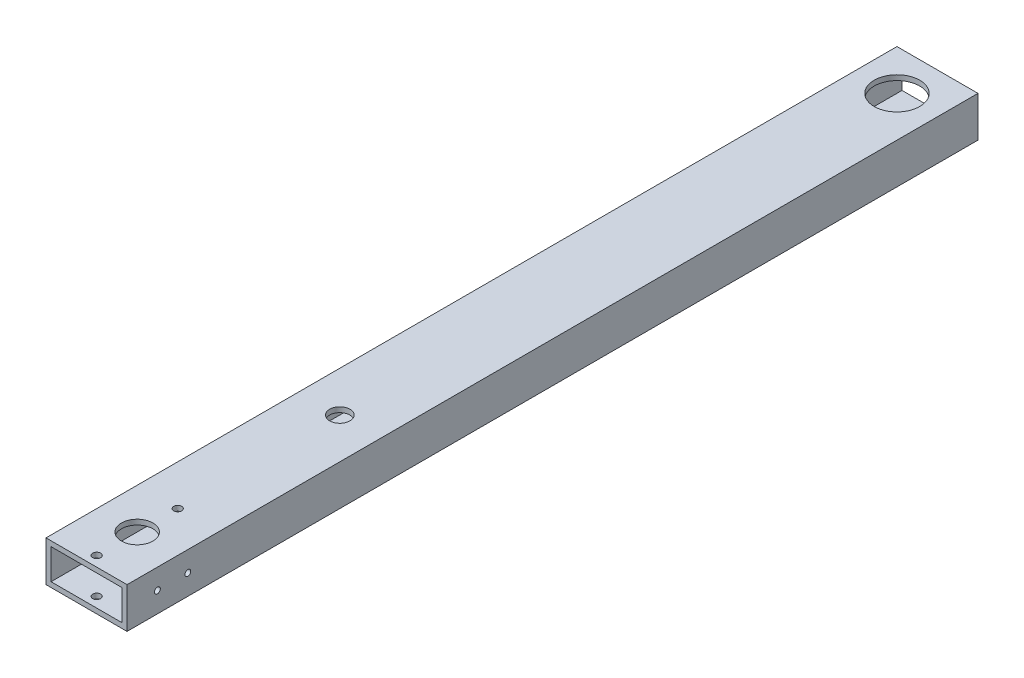
ISO-10303-21;
HEADER;
FILE_DESCRIPTION(('STEP AP214'),'2;1');
FILE_NAME('part.step','',(''),(''),'','','');
FILE_SCHEMA(('AUTOMOTIVE_DESIGN { 1 0 10303 214 1 1 1 1 }'));
ENDSEC;
DATA;
#1=APPLICATION_CONTEXT('core data for automotive mechanical design processes');
#2=APPLICATION_PROTOCOL_DEFINITION('international standard','automotive_design',2000,#1);
#3=PRODUCT_CONTEXT('',#1,'mechanical');
#4=PRODUCT('Part','Part','',(#3));
#5=PRODUCT_RELATED_PRODUCT_CATEGORY('part','',(#4));
#6=PRODUCT_DEFINITION_FORMATION('','',#4);
#7=PRODUCT_DEFINITION_CONTEXT('part definition',#1,'design');
#8=PRODUCT_DEFINITION('design','',#6,#7);
#9=PRODUCT_DEFINITION_SHAPE('','',#8);
#10=(LENGTH_UNIT() NAMED_UNIT(*) SI_UNIT(.MILLI.,.METRE.));
#11=(NAMED_UNIT(*) PLANE_ANGLE_UNIT() SI_UNIT($,.RADIAN.));
#12=(NAMED_UNIT(*) SI_UNIT($,.STERADIAN.) SOLID_ANGLE_UNIT());
#13=UNCERTAINTY_MEASURE_WITH_UNIT(LENGTH_MEASURE(1.E-05),#10,'distance_accuracy_value','');
#14=(GEOMETRIC_REPRESENTATION_CONTEXT(3) GLOBAL_UNCERTAINTY_ASSIGNED_CONTEXT((#13)) GLOBAL_UNIT_ASSIGNED_CONTEXT((#10,
#11,#12)) REPRESENTATION_CONTEXT('',''));
#15=CARTESIAN_POINT('',(0.,0.,0.));
#16=DIRECTION('',(0.,0.,1.));
#17=DIRECTION('',(1.,0.,0.));
#18=AXIS2_PLACEMENT_3D('',#15,#16,#17);
#19=CARTESIAN_POINT('',(25.4,-12.7,266.7));
#20=DIRECTION('',(-1.,0.,0.));
#21=DIRECTION('',(0.,0.,1.));
#22=AXIS2_PLACEMENT_3D('',#19,#20,#21);
#23=PLANE('',#22);
#24=CARTESIAN_POINT('',(25.4,0.,247.65));
#25=DIRECTION('',(1.,0.,0.));
#26=DIRECTION('',(0.,0.,-1.));
#27=AXIS2_PLACEMENT_3D('',#24,#25,#26);
#28=CIRCLE('',#27,1.8288);
#29=CARTESIAN_POINT('',(25.4,0.,245.8212));
#30=VERTEX_POINT('',#29);
#31=EDGE_CURVE('E273',#30,#30,#28,.T.);
#32=ORIENTED_EDGE('',*,*,#31,.F.);
#33=EDGE_LOOP('',(#32));
#34=FACE_BOUND('',#33,.T.);
#35=CARTESIAN_POINT('',(25.4,0.,228.6));
#36=DIRECTION('',(1.,0.,0.));
#37=DIRECTION('',(0.,0.,-1.));
#38=AXIS2_PLACEMENT_3D('',#35,#36,#37);
#39=CIRCLE('',#38,1.8288);
#40=CARTESIAN_POINT('',(25.4,0.,226.7712));
#41=VERTEX_POINT('',#40);
#42=EDGE_CURVE('E199',#41,#41,#39,.T.);
#43=ORIENTED_EDGE('',*,*,#42,.F.);
#44=EDGE_LOOP('',(#43));
#45=FACE_BOUND('',#44,.T.);
#46=DIRECTION('',(0.,1.,0.));
#47=VECTOR('',#46,1.);
#48=CARTESIAN_POINT('',(25.4,-12.7,-266.7));
#49=LINE('',#48,#47);
#50=CARTESIAN_POINT('',(25.4,-12.7,-266.7));
#51=VERTEX_POINT('',#50);
#52=CARTESIAN_POINT('',(25.4,12.7,-266.7));
#53=VERTEX_POINT('',#52);
#54=EDGE_CURVE('E136',#51,#53,#49,.T.);
#55=ORIENTED_EDGE('',*,*,#54,.T.);
#56=DIRECTION('',(0.,0.,-1.));
#57=VECTOR('',#56,1.);
#58=CARTESIAN_POINT('',(25.4,12.7,266.7));
#59=LINE('',#58,#57);
#60=CARTESIAN_POINT('',(25.4,12.7,266.7));
#61=VERTEX_POINT('',#60);
#62=EDGE_CURVE('E11',#61,#53,#59,.T.);
#63=ORIENTED_EDGE('',*,*,#62,.F.);
#64=DIRECTION('',(0.,1.,0.));
#65=VECTOR('',#64,1.);
#66=CARTESIAN_POINT('',(25.4,-12.7,266.7));
#67=LINE('',#66,#65);
#68=CARTESIAN_POINT('',(25.4,-12.7,266.7));
#69=VERTEX_POINT('',#68);
#70=EDGE_CURVE('E140',#69,#61,#67,.T.);
#71=ORIENTED_EDGE('',*,*,#70,.F.);
#72=DIRECTION('',(0.,0.,-1.));
#73=VECTOR('',#72,1.);
#74=CARTESIAN_POINT('',(25.4,-12.7,266.7));
#75=LINE('',#74,#73);
#76=EDGE_CURVE('E150',#69,#51,#75,.T.);
#77=ORIENTED_EDGE('',*,*,#76,.T.);
#78=EDGE_LOOP('',(#55,#63,#71,#77));
#79=FACE_BOUND('',#78,.T.);
#80=ADVANCED_FACE('F34',(#34,#45,#79),#23,.F.);
#81=CARTESIAN_POINT('',(-25.4,12.7,266.7));
#82=DIRECTION('',(0.,-1.,0.));
#83=DIRECTION('',(0.,0.,-1.));
#84=AXIS2_PLACEMENT_3D('',#81,#82,#83);
#85=PLANE('',#84);
#86=CARTESIAN_POINT('',(0.,12.7,107.95));
#87=DIRECTION('',(0.,1.,0.));
#88=DIRECTION('',(0.,0.,1.));
#89=AXIS2_PLACEMENT_3D('',#86,#87,#88);
#90=CIRCLE('',#89,6.34999999999999);
#91=CARTESIAN_POINT('',(0.,12.7,114.3));
#92=VERTEX_POINT('',#91);
#93=EDGE_CURVE('E196',#92,#92,#90,.T.);
#94=ORIENTED_EDGE('',*,*,#93,.F.);
#95=EDGE_LOOP('',(#94));
#96=FACE_BOUND('',#95,.T.);
#97=CARTESIAN_POINT('',(0.,12.7,-241.3));
#98=DIRECTION('',(0.,1.,0.));
#99=DIRECTION('',(0.,0.,1.));
#100=AXIS2_PLACEMENT_3D('',#97,#98,#99);
#101=CIRCLE('',#100,14.2875);
#102=CARTESIAN_POINT('',(0.,12.7,-227.0125));
#103=VERTEX_POINT('',#102);
#104=EDGE_CURVE('E184',#103,#103,#101,.T.);
#105=ORIENTED_EDGE('',*,*,#104,.F.);
#106=EDGE_LOOP('',(#105));
#107=FACE_BOUND('',#106,.T.);
#108=CARTESIAN_POINT('',(0.,12.7,209.55));
#109=DIRECTION('',(0.,1.,0.));
#110=DIRECTION('',(0.,0.,1.));
#111=AXIS2_PLACEMENT_3D('',#108,#109,#110);
#112=CIRCLE('',#111,2.48920000000002);
#113=CARTESIAN_POINT('',(0.,12.7,212.0392));
#114=VERTEX_POINT('',#113);
#115=EDGE_CURVE('E179',#114,#114,#112,.T.);
#116=ORIENTED_EDGE('',*,*,#115,.F.);
#117=EDGE_LOOP('',(#116));
#118=FACE_BOUND('',#117,.T.);
#119=CARTESIAN_POINT('',(0.,12.7,234.95));
#120=DIRECTION('',(0.,1.,0.));
#121=DIRECTION('',(0.,0.,1.));
#122=AXIS2_PLACEMENT_3D('',#119,#120,#121);
#123=CIRCLE('',#122,9.84885);
#124=CARTESIAN_POINT('',(0.,12.7,244.79885));
#125=VERTEX_POINT('',#124);
#126=EDGE_CURVE('E174',#125,#125,#123,.T.);
#127=ORIENTED_EDGE('',*,*,#126,.F.);
#128=EDGE_LOOP('',(#127));
#129=FACE_BOUND('',#128,.T.);
#130=CARTESIAN_POINT('',(0.,12.7,260.35));
#131=DIRECTION('',(0.,1.,0.));
#132=DIRECTION('',(0.,0.,1.));
#133=AXIS2_PLACEMENT_3D('',#130,#131,#132);
#134=CIRCLE('',#133,2.48920000000002);
#135=CARTESIAN_POINT('',(0.,12.7,262.8392));
#136=VERTEX_POINT('',#135);
#137=EDGE_CURVE('E169',#136,#136,#134,.T.);
#138=ORIENTED_EDGE('',*,*,#137,.F.);
#139=EDGE_LOOP('',(#138));
#140=FACE_BOUND('',#139,.T.);
#141=DIRECTION('',(-1.,0.,0.));
#142=VECTOR('',#141,1.);
#143=CARTESIAN_POINT('',(-25.4,12.7,-266.7));
#144=LINE('',#143,#142);
#145=CARTESIAN_POINT('',(-25.4,12.7,-266.7));
#146=VERTEX_POINT('',#145);
#147=EDGE_CURVE('E153',#53,#146,#144,.T.);
#148=ORIENTED_EDGE('',*,*,#147,.T.);
#149=DIRECTION('',(0.,0.,-1.));
#150=VECTOR('',#149,1.);
#151=CARTESIAN_POINT('',(-25.4,12.7,266.7));
#152=LINE('',#151,#150);
#153=CARTESIAN_POINT('',(-25.4,12.7,266.7));
#154=VERTEX_POINT('',#153);
#155=EDGE_CURVE('E42',#154,#146,#152,.T.);
#156=ORIENTED_EDGE('',*,*,#155,.F.);
#157=DIRECTION('',(-1.,0.,0.));
#158=VECTOR('',#157,1.);
#159=CARTESIAN_POINT('',(-25.4,12.7,266.7));
#160=LINE('',#159,#158);
#161=EDGE_CURVE('E143',#61,#154,#160,.T.);
#162=ORIENTED_EDGE('',*,*,#161,.F.);
#163=ORIENTED_EDGE('',*,*,#62,.T.);
#164=EDGE_LOOP('',(#148,#156,#162,#163));
#165=FACE_BOUND('',#164,.T.);
#166=ADVANCED_FACE('F261',(#96,#107,#118,#129,#140,#165),#85,.F.);
#167=CARTESIAN_POINT('',(-25.4,-12.7,266.7));
#168=DIRECTION('',(1.,0.,0.));
#169=DIRECTION('',(0.,0.,-1.));
#170=AXIS2_PLACEMENT_3D('',#167,#168,#169);
#171=PLANE('',#170);
#172=CARTESIAN_POINT('',(-25.4,0.,247.65));
#173=DIRECTION('',(1.,0.,0.));
#174=DIRECTION('',(0.,0.,-1.));
#175=AXIS2_PLACEMENT_3D('',#172,#173,#174);
#176=CIRCLE('',#175,1.82879999999999);
#177=CARTESIAN_POINT('',(-25.4,0.,245.8212));
#178=VERTEX_POINT('',#177);
#179=EDGE_CURVE('E438',#178,#178,#176,.T.);
#180=ORIENTED_EDGE('',*,*,#179,.T.);
#181=EDGE_LOOP('',(#180));
#182=FACE_BOUND('',#181,.T.);
#183=CARTESIAN_POINT('',(-25.4,0.,228.6));
#184=DIRECTION('',(1.,0.,0.));
#185=DIRECTION('',(0.,0.,-1.));
#186=AXIS2_PLACEMENT_3D('',#183,#184,#185);
#187=CIRCLE('',#186,1.82879999999999);
#188=CARTESIAN_POINT('',(-25.4,0.,226.7712));
#189=VERTEX_POINT('',#188);
#190=EDGE_CURVE('E192',#189,#189,#187,.T.);
#191=ORIENTED_EDGE('',*,*,#190,.T.);
#192=EDGE_LOOP('',(#191));
#193=FACE_BOUND('',#192,.T.);
#194=DIRECTION('',(0.,-1.,0.));
#195=VECTOR('',#194,1.);
#196=CARTESIAN_POINT('',(-25.4,-12.7,-266.7));
#197=LINE('',#196,#195);
#198=CARTESIAN_POINT('',(-25.4,-12.7,-266.7));
#199=VERTEX_POINT('',#198);
#200=EDGE_CURVE('E155',#146,#199,#197,.T.);
#201=ORIENTED_EDGE('',*,*,#200,.T.);
#202=DIRECTION('',(0.,0.,-1.));
#203=VECTOR('',#202,1.);
#204=CARTESIAN_POINT('',(-25.4,-12.7,266.7));
#205=LINE('',#204,#203);
#206=CARTESIAN_POINT('',(-25.4,-12.7,266.7));
#207=VERTEX_POINT('',#206);
#208=EDGE_CURVE('E160',#207,#199,#205,.T.);
#209=ORIENTED_EDGE('',*,*,#208,.F.);
#210=DIRECTION('',(0.,-1.,0.));
#211=VECTOR('',#210,1.);
#212=CARTESIAN_POINT('',(-25.4,-12.7,266.7));
#213=LINE('',#212,#211);
#214=EDGE_CURVE('E146',#154,#207,#213,.T.);
#215=ORIENTED_EDGE('',*,*,#214,.F.);
#216=ORIENTED_EDGE('',*,*,#155,.T.);
#217=EDGE_LOOP('',(#201,#209,#215,#216));
#218=FACE_BOUND('',#217,.T.);
#219=ADVANCED_FACE('F268',(#182,#193,#218),#171,.F.);
#220=CARTESIAN_POINT('',(-25.4,-12.7,266.7));
#221=DIRECTION('',(0.,1.,0.));
#222=DIRECTION('',(0.,0.,1.));
#223=AXIS2_PLACEMENT_3D('',#220,#221,#222);
#224=PLANE('',#223);
#225=CARTESIAN_POINT('',(0.,-12.7,107.95));
#226=DIRECTION('',(0.,1.,0.));
#227=DIRECTION('',(0.,0.,1.));
#228=AXIS2_PLACEMENT_3D('',#225,#226,#227);
#229=CIRCLE('',#228,6.34999999999999);
#230=CARTESIAN_POINT('',(0.,-12.7,114.3));
#231=VERTEX_POINT('',#230);
#232=EDGE_CURVE('E188',#231,#231,#229,.T.);
#233=ORIENTED_EDGE('',*,*,#232,.T.);
#234=EDGE_LOOP('',(#233));
#235=FACE_BOUND('',#234,.T.);
#236=CARTESIAN_POINT('',(0.,-12.7,-241.3));
#237=DIRECTION('',(0.,1.,0.));
#238=DIRECTION('',(0.,0.,1.));
#239=AXIS2_PLACEMENT_3D('',#236,#237,#238);
#240=CIRCLE('',#239,14.2875);
#241=CARTESIAN_POINT('',(0.,-12.7,-227.0125));
#242=VERTEX_POINT('',#241);
#243=EDGE_CURVE('E218',#242,#242,#240,.T.);
#244=ORIENTED_EDGE('',*,*,#243,.T.);
#245=EDGE_LOOP('',(#244));
#246=FACE_BOUND('',#245,.T.);
#247=CARTESIAN_POINT('',(0.,-12.7,209.55));
#248=DIRECTION('',(0.,1.,0.));
#249=DIRECTION('',(0.,0.,1.));
#250=AXIS2_PLACEMENT_3D('',#247,#248,#249);
#251=CIRCLE('',#250,2.48920000000002);
#252=CARTESIAN_POINT('',(0.,-12.7,212.0392));
#253=VERTEX_POINT('',#252);
#254=EDGE_CURVE('E225',#253,#253,#251,.T.);
#255=ORIENTED_EDGE('',*,*,#254,.T.);
#256=EDGE_LOOP('',(#255));
#257=FACE_BOUND('',#256,.T.);
#258=CARTESIAN_POINT('',(0.,-12.7,234.95));
#259=DIRECTION('',(0.,1.,0.));
#260=DIRECTION('',(0.,0.,1.));
#261=AXIS2_PLACEMENT_3D('',#258,#259,#260);
#262=CIRCLE('',#261,9.84885);
#263=CARTESIAN_POINT('',(0.,-12.7,244.79885));
#264=VERTEX_POINT('',#263);
#265=EDGE_CURVE('E232',#264,#264,#262,.T.);
#266=ORIENTED_EDGE('',*,*,#265,.T.);
#267=EDGE_LOOP('',(#266));
#268=FACE_BOUND('',#267,.T.);
#269=CARTESIAN_POINT('',(0.,-12.7,260.35));
#270=DIRECTION('',(0.,1.,0.));
#271=DIRECTION('',(0.,0.,1.));
#272=AXIS2_PLACEMENT_3D('',#269,#270,#271);
#273=CIRCLE('',#272,2.48920000000002);
#274=CARTESIAN_POINT('',(0.,-12.7,262.8392));
#275=VERTEX_POINT('',#274);
#276=EDGE_CURVE('E124',#275,#275,#273,.T.);
#277=ORIENTED_EDGE('',*,*,#276,.T.);
#278=EDGE_LOOP('',(#277));
#279=FACE_BOUND('',#278,.T.);
#280=DIRECTION('',(1.,0.,0.));
#281=VECTOR('',#280,1.);
#282=CARTESIAN_POINT('',(-25.4,-12.7,-266.7));
#283=LINE('',#282,#281);
#284=EDGE_CURVE('E144',#199,#51,#283,.T.);
#285=ORIENTED_EDGE('',*,*,#284,.T.);
#286=ORIENTED_EDGE('',*,*,#76,.F.);
#287=DIRECTION('',(1.,0.,0.));
#288=VECTOR('',#287,1.);
#289=CARTESIAN_POINT('',(-25.4,-12.7,266.7));
#290=LINE('',#289,#288);
#291=EDGE_CURVE('E148',#207,#69,#290,.T.);
#292=ORIENTED_EDGE('',*,*,#291,.F.);
#293=ORIENTED_EDGE('',*,*,#208,.T.);
#294=EDGE_LOOP('',(#285,#286,#292,#293));
#295=FACE_BOUND('',#294,.T.);
#296=ADVANCED_FACE('F242',(#235,#246,#257,#268,#279,#295),#224,.F.);
#297=CARTESIAN_POINT('',(0.,0.,266.7));
#298=DIRECTION('',(0.,0.,-1.));
#299=DIRECTION('',(-1.,0.,0.));
#300=AXIS2_PLACEMENT_3D('',#297,#298,#299);
#301=PLANE('',#300);
#302=DIRECTION('',(0.,1.,0.));
#303=VECTOR('',#302,1.);
#304=CARTESIAN_POINT('',(22.225,-9.525,266.7));
#305=LINE('',#304,#303);
#306=CARTESIAN_POINT('',(22.225,-9.525,266.7));
#307=VERTEX_POINT('',#306);
#308=CARTESIAN_POINT('',(22.225,9.525,266.7));
#309=VERTEX_POINT('',#308);
#310=EDGE_CURVE('E130',#307,#309,#305,.T.);
#311=ORIENTED_EDGE('',*,*,#310,.F.);
#312=DIRECTION('',(1.,0.,0.));
#313=VECTOR('',#312,1.);
#314=CARTESIAN_POINT('',(-22.225,-9.525,266.7));
#315=LINE('',#314,#313);
#316=CARTESIAN_POINT('',(-22.225,-9.525,266.7));
#317=VERTEX_POINT('',#316);
#318=EDGE_CURVE('E50',#317,#307,#315,.T.);
#319=ORIENTED_EDGE('',*,*,#318,.F.);
#320=DIRECTION('',(0.,-1.,0.));
#321=VECTOR('',#320,1.);
#322=CARTESIAN_POINT('',(-22.225,9.525,266.7));
#323=LINE('',#322,#321);
#324=CARTESIAN_POINT('',(-22.225,9.525,266.7));
#325=VERTEX_POINT('',#324);
#326=EDGE_CURVE('E118',#325,#317,#323,.T.);
#327=ORIENTED_EDGE('',*,*,#326,.F.);
#328=DIRECTION('',(-1.,0.,0.));
#329=VECTOR('',#328,1.);
#330=CARTESIAN_POINT('',(22.225,9.525,266.7));
#331=LINE('',#330,#329);
#332=EDGE_CURVE('E121',#309,#325,#331,.T.);
#333=ORIENTED_EDGE('',*,*,#332,.F.);
#334=EDGE_LOOP('',(#311,#319,#327,#333));
#335=FACE_BOUND('',#334,.T.);
#336=ORIENTED_EDGE('',*,*,#70,.T.);
#337=ORIENTED_EDGE('',*,*,#161,.T.);
#338=ORIENTED_EDGE('',*,*,#214,.T.);
#339=ORIENTED_EDGE('',*,*,#291,.T.);
#340=EDGE_LOOP('',(#336,#337,#338,#339));
#341=FACE_BOUND('',#340,.T.);
#342=ADVANCED_FACE('F286',(#335,#341),#301,.F.);
#343=CARTESIAN_POINT('',(0.,0.,-266.7));
#344=DIRECTION('',(0.,0.,-1.));
#345=DIRECTION('',(-1.,0.,0.));
#346=AXIS2_PLACEMENT_3D('',#343,#344,#345);
#347=PLANE('',#346);
#348=DIRECTION('',(1.,0.,0.));
#349=VECTOR('',#348,1.);
#350=CARTESIAN_POINT('',(-22.225,-9.525,-266.7));
#351=LINE('',#350,#349);
#352=CARTESIAN_POINT('',(-22.225,-9.525,-266.7));
#353=VERTEX_POINT('',#352);
#354=CARTESIAN_POINT('',(22.225,-9.525,-266.7));
#355=VERTEX_POINT('',#354);
#356=EDGE_CURVE('E102',#353,#355,#351,.T.);
#357=ORIENTED_EDGE('',*,*,#356,.T.);
#358=DIRECTION('',(0.,1.,0.));
#359=VECTOR('',#358,1.);
#360=CARTESIAN_POINT('',(22.225,-9.525,-266.7));
#361=LINE('',#360,#359);
#362=CARTESIAN_POINT('',(22.225,9.525,-266.7));
#363=VERTEX_POINT('',#362);
#364=EDGE_CURVE('E111',#355,#363,#361,.T.);
#365=ORIENTED_EDGE('',*,*,#364,.T.);
#366=DIRECTION('',(-1.,0.,0.));
#367=VECTOR('',#366,1.);
#368=CARTESIAN_POINT('',(22.225,9.525,-266.7));
#369=LINE('',#368,#367);
#370=CARTESIAN_POINT('',(-22.225,9.525,-266.7));
#371=VERTEX_POINT('',#370);
#372=EDGE_CURVE('E58',#363,#371,#369,.T.);
#373=ORIENTED_EDGE('',*,*,#372,.T.);
#374=DIRECTION('',(0.,-1.,0.));
#375=VECTOR('',#374,1.);
#376=CARTESIAN_POINT('',(-22.225,9.525,-266.7));
#377=LINE('',#376,#375);
#378=EDGE_CURVE('E108',#371,#353,#377,.T.);
#379=ORIENTED_EDGE('',*,*,#378,.T.);
#380=EDGE_LOOP('',(#357,#365,#373,#379));
#381=FACE_BOUND('',#380,.T.);
#382=ORIENTED_EDGE('',*,*,#54,.F.);
#383=ORIENTED_EDGE('',*,*,#284,.F.);
#384=ORIENTED_EDGE('',*,*,#200,.F.);
#385=ORIENTED_EDGE('',*,*,#147,.F.);
#386=EDGE_LOOP('',(#382,#383,#384,#385));
#387=FACE_BOUND('',#386,.T.);
#388=ADVANCED_FACE('F115',(#381,#387),#347,.T.);
#389=CARTESIAN_POINT('',(-22.225,-9.525,-266.7));
#390=DIRECTION('',(0.,-1.,0.));
#391=DIRECTION('',(0.,0.,-1.));
#392=AXIS2_PLACEMENT_3D('',#389,#390,#391);
#393=PLANE('',#392);
#394=CARTESIAN_POINT('',(0.,-9.525,107.95));
#395=DIRECTION('',(0.,-1.,0.));
#396=DIRECTION('',(0.,0.,-1.));
#397=AXIS2_PLACEMENT_3D('',#394,#395,#396);
#398=CIRCLE('',#397,6.34999999999999);
#399=CARTESIAN_POINT('',(0.,-9.525,101.6));
#400=VERTEX_POINT('',#399);
#401=EDGE_CURVE('E187',#400,#400,#398,.T.);
#402=ORIENTED_EDGE('',*,*,#401,.T.);
#403=EDGE_LOOP('',(#402));
#404=FACE_BOUND('',#403,.T.);
#405=CARTESIAN_POINT('',(0.,-9.52500000000001,-241.3));
#406=DIRECTION('',(0.,-1.,0.));
#407=DIRECTION('',(0.,0.,-1.));
#408=AXIS2_PLACEMENT_3D('',#405,#406,#407);
#409=CIRCLE('',#408,14.2875);
#410=CARTESIAN_POINT('',(0.,-9.52500000000001,-255.5875));
#411=VERTEX_POINT('',#410);
#412=EDGE_CURVE('E183',#411,#411,#409,.T.);
#413=ORIENTED_EDGE('',*,*,#412,.T.);
#414=EDGE_LOOP('',(#413));
#415=FACE_BOUND('',#414,.T.);
#416=CARTESIAN_POINT('',(0.,-9.52500000000001,209.55));
#417=DIRECTION('',(0.,-1.,0.));
#418=DIRECTION('',(0.,0.,-1.));
#419=AXIS2_PLACEMENT_3D('',#416,#417,#418);
#420=CIRCLE('',#419,2.48920000000002);
#421=CARTESIAN_POINT('',(0.,-9.52500000000001,207.0608));
#422=VERTEX_POINT('',#421);
#423=EDGE_CURVE('E178',#422,#422,#420,.T.);
#424=ORIENTED_EDGE('',*,*,#423,.T.);
#425=EDGE_LOOP('',(#424));
#426=FACE_BOUND('',#425,.T.);
#427=CARTESIAN_POINT('',(0.,-9.52500000000001,234.95));
#428=DIRECTION('',(0.,-1.,0.));
#429=DIRECTION('',(0.,0.,-1.));
#430=AXIS2_PLACEMENT_3D('',#427,#428,#429);
#431=CIRCLE('',#430,9.84885);
#432=CARTESIAN_POINT('',(0.,-9.52500000000001,225.10115));
#433=VERTEX_POINT('',#432);
#434=EDGE_CURVE('E173',#433,#433,#431,.T.);
#435=ORIENTED_EDGE('',*,*,#434,.T.);
#436=EDGE_LOOP('',(#435));
#437=FACE_BOUND('',#436,.T.);
#438=CARTESIAN_POINT('',(0.,-9.52500000000001,260.35));
#439=DIRECTION('',(0.,-1.,0.));
#440=DIRECTION('',(0.,0.,-1.));
#441=AXIS2_PLACEMENT_3D('',#438,#439,#440);
#442=CIRCLE('',#441,2.48920000000002);
#443=CARTESIAN_POINT('',(0.,-9.52500000000001,257.8608));
#444=VERTEX_POINT('',#443);
#445=EDGE_CURVE('E168',#444,#444,#442,.T.);
#446=ORIENTED_EDGE('',*,*,#445,.T.);
#447=EDGE_LOOP('',(#446));
#448=FACE_BOUND('',#447,.T.);
#449=ORIENTED_EDGE('',*,*,#318,.T.);
#450=DIRECTION('',(0.,0.,1.));
#451=VECTOR('',#450,1.);
#452=CARTESIAN_POINT('',(22.225,-9.525,-266.7));
#453=LINE('',#452,#451);
#454=EDGE_CURVE('E98',#355,#307,#453,.T.);
#455=ORIENTED_EDGE('',*,*,#454,.F.);
#456=ORIENTED_EDGE('',*,*,#356,.F.);
#457=DIRECTION('',(0.,0.,1.));
#458=VECTOR('',#457,1.);
#459=CARTESIAN_POINT('',(-22.225,-9.525,-266.7));
#460=LINE('',#459,#458);
#461=EDGE_CURVE('E134',#353,#317,#460,.T.);
#462=ORIENTED_EDGE('',*,*,#461,.T.);
#463=EDGE_LOOP('',(#449,#455,#456,#462));
#464=FACE_BOUND('',#463,.T.);
#465=ADVANCED_FACE('F100',(#404,#415,#426,#437,#448,#464),#393,.F.);
#466=CARTESIAN_POINT('',(-22.225,9.525,-266.7));
#467=DIRECTION('',(-1.,0.,0.));
#468=DIRECTION('',(0.,0.,1.));
#469=AXIS2_PLACEMENT_3D('',#466,#467,#468);
#470=PLANE('',#469);
#471=CARTESIAN_POINT('',(-22.225,0.,247.65));
#472=DIRECTION('',(-1.,0.,0.));
#473=DIRECTION('',(0.,0.,1.));
#474=AXIS2_PLACEMENT_3D('',#471,#472,#473);
#475=CIRCLE('',#474,1.82879999999999);
#476=CARTESIAN_POINT('',(-22.225,0.,249.4788));
#477=VERTEX_POINT('',#476);
#478=EDGE_CURVE('E204',#477,#477,#475,.T.);
#479=ORIENTED_EDGE('',*,*,#478,.T.);
#480=EDGE_LOOP('',(#479));
#481=FACE_BOUND('',#480,.T.);
#482=CARTESIAN_POINT('',(-22.225,0.,228.6));
#483=DIRECTION('',(-1.,0.,0.));
#484=DIRECTION('',(0.,0.,1.));
#485=AXIS2_PLACEMENT_3D('',#482,#483,#484);
#486=CIRCLE('',#485,1.82879999999999);
#487=CARTESIAN_POINT('',(-22.225,0.,230.4288));
#488=VERTEX_POINT('',#487);
#489=EDGE_CURVE('E191',#488,#488,#486,.T.);
#490=ORIENTED_EDGE('',*,*,#489,.T.);
#491=EDGE_LOOP('',(#490));
#492=FACE_BOUND('',#491,.T.);
#493=ORIENTED_EDGE('',*,*,#326,.T.);
#494=ORIENTED_EDGE('',*,*,#461,.F.);
#495=ORIENTED_EDGE('',*,*,#378,.F.);
#496=DIRECTION('',(0.,0.,1.));
#497=VECTOR('',#496,1.);
#498=CARTESIAN_POINT('',(-22.225,9.525,-266.7));
#499=LINE('',#498,#497);
#500=EDGE_CURVE('E137',#371,#325,#499,.T.);
#501=ORIENTED_EDGE('',*,*,#500,.T.);
#502=EDGE_LOOP('',(#493,#494,#495,#501));
#503=FACE_BOUND('',#502,.T.);
#504=ADVANCED_FACE('F307',(#481,#492,#503),#470,.F.);
#505=CARTESIAN_POINT('',(22.225,9.525,-266.7));
#506=DIRECTION('',(0.,1.,0.));
#507=DIRECTION('',(0.,0.,1.));
#508=AXIS2_PLACEMENT_3D('',#505,#506,#507);
#509=PLANE('',#508);
#510=CARTESIAN_POINT('',(0.,9.525,107.95));
#511=DIRECTION('',(0.,1.,0.));
#512=DIRECTION('',(0.,0.,1.));
#513=AXIS2_PLACEMENT_3D('',#510,#511,#512);
#514=CIRCLE('',#513,6.34999999999999);
#515=CARTESIAN_POINT('',(0.,9.525,114.3));
#516=VERTEX_POINT('',#515);
#517=EDGE_CURVE('E185',#516,#516,#514,.T.);
#518=ORIENTED_EDGE('',*,*,#517,.T.);
#519=EDGE_LOOP('',(#518));
#520=FACE_BOUND('',#519,.T.);
#521=CARTESIAN_POINT('',(0.,9.52499999999995,-241.3));
#522=DIRECTION('',(0.,1.,0.));
#523=DIRECTION('',(0.,0.,1.));
#524=AXIS2_PLACEMENT_3D('',#521,#522,#523);
#525=CIRCLE('',#524,14.2875);
#526=CARTESIAN_POINT('',(0.,9.52499999999995,-227.0125));
#527=VERTEX_POINT('',#526);
#528=EDGE_CURVE('E180',#527,#527,#525,.T.);
#529=ORIENTED_EDGE('',*,*,#528,.T.);
#530=EDGE_LOOP('',(#529));
#531=FACE_BOUND('',#530,.T.);
#532=CARTESIAN_POINT('',(0.,9.52499999999995,209.55));
#533=DIRECTION('',(0.,1.,0.));
#534=DIRECTION('',(0.,0.,1.));
#535=AXIS2_PLACEMENT_3D('',#532,#533,#534);
#536=CIRCLE('',#535,2.48920000000002);
#537=CARTESIAN_POINT('',(0.,9.52499999999995,212.0392));
#538=VERTEX_POINT('',#537);
#539=EDGE_CURVE('E175',#538,#538,#536,.T.);
#540=ORIENTED_EDGE('',*,*,#539,.T.);
#541=EDGE_LOOP('',(#540));
#542=FACE_BOUND('',#541,.T.);
#543=CARTESIAN_POINT('',(0.,9.52499999999995,234.95));
#544=DIRECTION('',(0.,1.,0.));
#545=DIRECTION('',(0.,0.,1.));
#546=AXIS2_PLACEMENT_3D('',#543,#544,#545);
#547=CIRCLE('',#546,9.84885);
#548=CARTESIAN_POINT('',(0.,9.52499999999995,244.79885));
#549=VERTEX_POINT('',#548);
#550=EDGE_CURVE('E170',#549,#549,#547,.T.);
#551=ORIENTED_EDGE('',*,*,#550,.T.);
#552=EDGE_LOOP('',(#551));
#553=FACE_BOUND('',#552,.T.);
#554=CARTESIAN_POINT('',(0.,9.52499999999995,260.35));
#555=DIRECTION('',(0.,1.,0.));
#556=DIRECTION('',(0.,0.,1.));
#557=AXIS2_PLACEMENT_3D('',#554,#555,#556);
#558=CIRCLE('',#557,2.48920000000002);
#559=CARTESIAN_POINT('',(0.,9.52499999999995,262.8392));
#560=VERTEX_POINT('',#559);
#561=EDGE_CURVE('E165',#560,#560,#558,.T.);
#562=ORIENTED_EDGE('',*,*,#561,.T.);
#563=EDGE_LOOP('',(#562));
#564=FACE_BOUND('',#563,.T.);
#565=ORIENTED_EDGE('',*,*,#332,.T.);
#566=ORIENTED_EDGE('',*,*,#500,.F.);
#567=ORIENTED_EDGE('',*,*,#372,.F.);
#568=DIRECTION('',(0.,0.,1.));
#569=VECTOR('',#568,1.);
#570=CARTESIAN_POINT('',(22.225,9.525,-266.7));
#571=LINE('',#570,#569);
#572=EDGE_CURVE('E107',#363,#309,#571,.T.);
#573=ORIENTED_EDGE('',*,*,#572,.T.);
#574=EDGE_LOOP('',(#565,#566,#567,#573));
#575=FACE_BOUND('',#574,.T.);
#576=ADVANCED_FACE('F311',(#520,#531,#542,#553,#564,#575),#509,.F.);
#577=CARTESIAN_POINT('',(22.225,-9.525,-266.7));
#578=DIRECTION('',(1.,0.,0.));
#579=DIRECTION('',(0.,0.,-1.));
#580=AXIS2_PLACEMENT_3D('',#577,#578,#579);
#581=PLANE('',#580);
#582=CARTESIAN_POINT('',(22.225,0.,247.65));
#583=DIRECTION('',(1.,0.,0.));
#584=DIRECTION('',(0.,0.,-1.));
#585=AXIS2_PLACEMENT_3D('',#582,#583,#584);
#586=CIRCLE('',#585,1.82879999999999);
#587=CARTESIAN_POINT('',(22.225,0.,245.8212));
#588=VERTEX_POINT('',#587);
#589=EDGE_CURVE('E37',#588,#588,#586,.T.);
#590=ORIENTED_EDGE('',*,*,#589,.T.);
#591=EDGE_LOOP('',(#590));
#592=FACE_BOUND('',#591,.T.);
#593=CARTESIAN_POINT('',(22.225,0.,228.6));
#594=DIRECTION('',(1.,0.,0.));
#595=DIRECTION('',(0.,0.,-1.));
#596=AXIS2_PLACEMENT_3D('',#593,#594,#595);
#597=CIRCLE('',#596,1.82879999999999);
#598=CARTESIAN_POINT('',(22.225,0.,226.7712));
#599=VERTEX_POINT('',#598);
#600=EDGE_CURVE('E189',#599,#599,#597,.T.);
#601=ORIENTED_EDGE('',*,*,#600,.T.);
#602=EDGE_LOOP('',(#601));
#603=FACE_BOUND('',#602,.T.);
#604=ORIENTED_EDGE('',*,*,#310,.T.);
#605=ORIENTED_EDGE('',*,*,#572,.F.);
#606=ORIENTED_EDGE('',*,*,#364,.F.);
#607=ORIENTED_EDGE('',*,*,#454,.T.);
#608=EDGE_LOOP('',(#604,#605,#606,#607));
#609=FACE_BOUND('',#608,.T.);
#610=ADVANCED_FACE('F112',(#592,#603,#609),#581,.F.);
#611=CARTESIAN_POINT('',(0.,-495.3,260.35));
#612=DIRECTION('',(0.,1.,0.));
#613=DIRECTION('',(0.,0.,1.));
#614=AXIS2_PLACEMENT_3D('',#611,#612,#613);
#615=CYLINDRICAL_SURFACE('',#614,2.48920000000002);
#616=ORIENTED_EDGE('',*,*,#137,.T.);
#617=EDGE_LOOP('',(#616));
#618=FACE_BOUND('',#617,.T.);
#619=ORIENTED_EDGE('',*,*,#561,.F.);
#620=EDGE_LOOP('',(#619));
#621=FACE_BOUND('',#620,.T.);
#622=ADVANCED_FACE('F248',(#618,#621),#615,.F.);
#623=ORIENTED_EDGE('',*,*,#445,.F.);
#624=EDGE_LOOP('',(#623));
#625=FACE_BOUND('',#624,.T.);
#626=ORIENTED_EDGE('',*,*,#276,.F.);
#627=EDGE_LOOP('',(#626));
#628=FACE_BOUND('',#627,.T.);
#629=ADVANCED_FACE('F245',(#625,#628),#615,.F.);
#630=CARTESIAN_POINT('',(0.,-495.3,234.95));
#631=DIRECTION('',(0.,1.,0.));
#632=DIRECTION('',(0.,0.,1.));
#633=AXIS2_PLACEMENT_3D('',#630,#631,#632);
#634=CYLINDRICAL_SURFACE('',#633,9.84885);
#635=ORIENTED_EDGE('',*,*,#126,.T.);
#636=EDGE_LOOP('',(#635));
#637=FACE_BOUND('',#636,.T.);
#638=ORIENTED_EDGE('',*,*,#550,.F.);
#639=EDGE_LOOP('',(#638));
#640=FACE_BOUND('',#639,.T.);
#641=ADVANCED_FACE('F247',(#637,#640),#634,.F.);
#642=ORIENTED_EDGE('',*,*,#434,.F.);
#643=EDGE_LOOP('',(#642));
#644=FACE_BOUND('',#643,.T.);
#645=ORIENTED_EDGE('',*,*,#265,.F.);
#646=EDGE_LOOP('',(#645));
#647=FACE_BOUND('',#646,.T.);
#648=ADVANCED_FACE('F255',(#644,#647),#634,.F.);
#649=CARTESIAN_POINT('',(0.,-495.3,209.55));
#650=DIRECTION('',(0.,1.,0.));
#651=DIRECTION('',(0.,0.,1.));
#652=AXIS2_PLACEMENT_3D('',#649,#650,#651);
#653=CYLINDRICAL_SURFACE('',#652,2.48920000000002);
#654=ORIENTED_EDGE('',*,*,#115,.T.);
#655=EDGE_LOOP('',(#654));
#656=FACE_BOUND('',#655,.T.);
#657=ORIENTED_EDGE('',*,*,#539,.F.);
#658=EDGE_LOOP('',(#657));
#659=FACE_BOUND('',#658,.T.);
#660=ADVANCED_FACE('F353',(#656,#659),#653,.F.);
#661=ORIENTED_EDGE('',*,*,#423,.F.);
#662=EDGE_LOOP('',(#661));
#663=FACE_BOUND('',#662,.T.);
#664=ORIENTED_EDGE('',*,*,#254,.F.);
#665=EDGE_LOOP('',(#664));
#666=FACE_BOUND('',#665,.T.);
#667=ADVANCED_FACE('F351',(#663,#666),#653,.F.);
#668=CARTESIAN_POINT('',(0.,-495.3,-241.3));
#669=DIRECTION('',(0.,1.,0.));
#670=DIRECTION('',(0.,0.,1.));
#671=AXIS2_PLACEMENT_3D('',#668,#669,#670);
#672=CYLINDRICAL_SURFACE('',#671,14.2875);
#673=ORIENTED_EDGE('',*,*,#104,.T.);
#674=EDGE_LOOP('',(#673));
#675=FACE_BOUND('',#674,.T.);
#676=ORIENTED_EDGE('',*,*,#528,.F.);
#677=EDGE_LOOP('',(#676));
#678=FACE_BOUND('',#677,.T.);
#679=ADVANCED_FACE('F349',(#675,#678),#672,.F.);
#680=ORIENTED_EDGE('',*,*,#412,.F.);
#681=EDGE_LOOP('',(#680));
#682=FACE_BOUND('',#681,.T.);
#683=ORIENTED_EDGE('',*,*,#243,.F.);
#684=EDGE_LOOP('',(#683));
#685=FACE_BOUND('',#684,.T.);
#686=ADVANCED_FACE('F346',(#682,#685),#672,.F.);
#687=CARTESIAN_POINT('',(0.,-12.7,107.95));
#688=DIRECTION('',(0.,1.,0.));
#689=DIRECTION('',(0.,0.,1.));
#690=AXIS2_PLACEMENT_3D('',#687,#688,#689);
#691=CYLINDRICAL_SURFACE('',#690,6.34999999999999);
#692=ORIENTED_EDGE('',*,*,#93,.T.);
#693=EDGE_LOOP('',(#692));
#694=FACE_BOUND('',#693,.T.);
#695=ORIENTED_EDGE('',*,*,#517,.F.);
#696=EDGE_LOOP('',(#695));
#697=FACE_BOUND('',#696,.T.);
#698=ADVANCED_FACE('F344',(#694,#697),#691,.F.);
#699=ORIENTED_EDGE('',*,*,#232,.F.);
#700=EDGE_LOOP('',(#699));
#701=FACE_BOUND('',#700,.T.);
#702=ORIENTED_EDGE('',*,*,#401,.F.);
#703=EDGE_LOOP('',(#702));
#704=FACE_BOUND('',#703,.T.);
#705=ADVANCED_FACE('F339',(#701,#704),#691,.F.);
#706=CARTESIAN_POINT('',(25.4,0.,228.6));
#707=DIRECTION('',(1.,0.,0.));
#708=DIRECTION('',(0.,0.,-1.));
#709=AXIS2_PLACEMENT_3D('',#706,#707,#708);
#710=CYLINDRICAL_SURFACE('',#709,1.82879999999999);
#711=ORIENTED_EDGE('',*,*,#42,.T.);
#712=EDGE_LOOP('',(#711));
#713=FACE_BOUND('',#712,.T.);
#714=ORIENTED_EDGE('',*,*,#600,.F.);
#715=EDGE_LOOP('',(#714));
#716=FACE_BOUND('',#715,.T.);
#717=ADVANCED_FACE('F329',(#713,#716),#710,.F.);
#718=ORIENTED_EDGE('',*,*,#190,.F.);
#719=EDGE_LOOP('',(#718));
#720=FACE_BOUND('',#719,.T.);
#721=ORIENTED_EDGE('',*,*,#489,.F.);
#722=EDGE_LOOP('',(#721));
#723=FACE_BOUND('',#722,.T.);
#724=ADVANCED_FACE('F326',(#720,#723),#710,.F.);
#725=CARTESIAN_POINT('',(25.4,0.,247.65));
#726=DIRECTION('',(1.,0.,0.));
#727=DIRECTION('',(0.,0.,-1.));
#728=AXIS2_PLACEMENT_3D('',#725,#726,#727);
#729=CYLINDRICAL_SURFACE('',#728,1.82879999999999);
#730=ORIENTED_EDGE('',*,*,#31,.T.);
#731=EDGE_LOOP('',(#730));
#732=FACE_BOUND('',#731,.T.);
#733=ORIENTED_EDGE('',*,*,#589,.F.);
#734=EDGE_LOOP('',(#733));
#735=FACE_BOUND('',#734,.T.);
#736=ADVANCED_FACE('F328',(#732,#735),#729,.F.);
#737=ORIENTED_EDGE('',*,*,#179,.F.);
#738=EDGE_LOOP('',(#737));
#739=FACE_BOUND('',#738,.T.);
#740=ORIENTED_EDGE('',*,*,#478,.F.);
#741=EDGE_LOOP('',(#740));
#742=FACE_BOUND('',#741,.T.);
#743=ADVANCED_FACE('F336',(#739,#742),#729,.F.);
#744=CLOSED_SHELL('',(#80,#166,#219,#296,#342,#388,#465,#504,#576,#610,#622,#629,#641,#648,#660,
#667,#679,#686,#698,#705,#717,#724,#736,#743));
#745=MANIFOLD_SOLID_BREP('B2',#744);
#746=ADVANCED_BREP_SHAPE_REPRESENTATION('',(#18,#745),#14);
#747=SHAPE_DEFINITION_REPRESENTATION(#9,#746);
ENDSEC;
END-ISO-10303-21;
